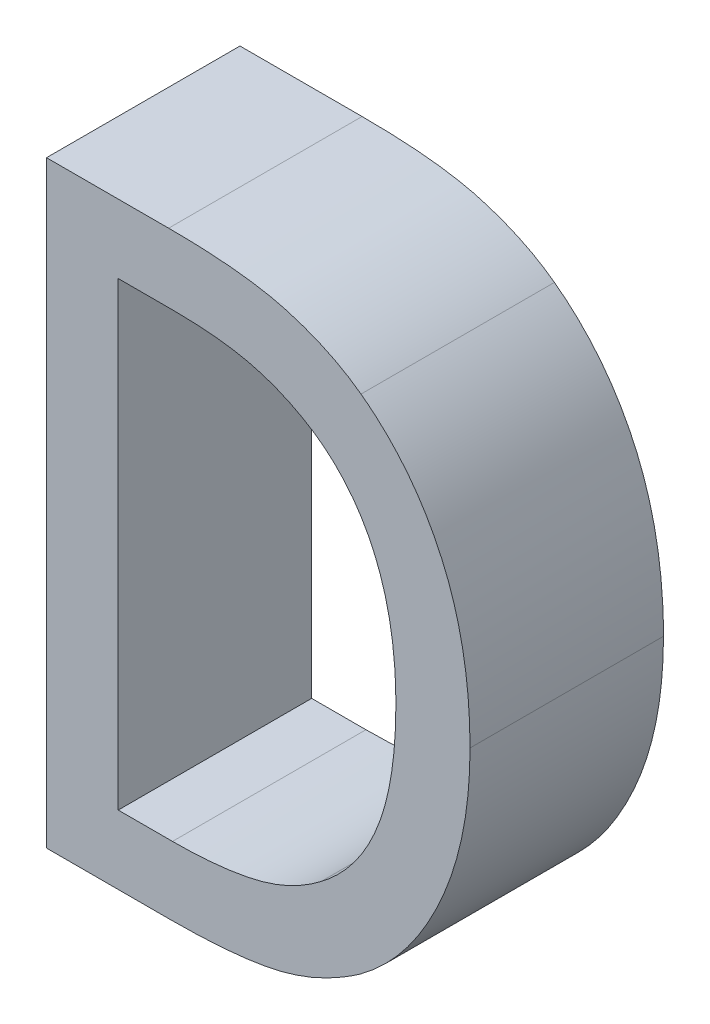
ISO-10303-21;
HEADER;
FILE_DESCRIPTION(('STEP AP214'),'2;1');
FILE_NAME('part.step','',(''),(''),'','','');
FILE_SCHEMA(('AUTOMOTIVE_DESIGN { 1 0 10303 214 1 1 1 1 }'));
ENDSEC;
DATA;
#1=APPLICATION_CONTEXT('core data for automotive mechanical design processes');
#2=APPLICATION_PROTOCOL_DEFINITION('international standard','automotive_design',2000,#1);
#3=PRODUCT_CONTEXT('',#1,'mechanical');
#4=PRODUCT('Part','Part','',(#3));
#5=PRODUCT_RELATED_PRODUCT_CATEGORY('part','',(#4));
#6=PRODUCT_DEFINITION_FORMATION('','',#4);
#7=PRODUCT_DEFINITION_CONTEXT('part definition',#1,'design');
#8=PRODUCT_DEFINITION('design','',#6,#7);
#9=PRODUCT_DEFINITION_SHAPE('','',#8);
#10=(LENGTH_UNIT() NAMED_UNIT(*) SI_UNIT(.MILLI.,.METRE.));
#11=(NAMED_UNIT(*) PLANE_ANGLE_UNIT() SI_UNIT($,.RADIAN.));
#12=(NAMED_UNIT(*) SI_UNIT($,.STERADIAN.) SOLID_ANGLE_UNIT());
#13=UNCERTAINTY_MEASURE_WITH_UNIT(LENGTH_MEASURE(1.E-05),#10,'distance_accuracy_value','');
#14=(GEOMETRIC_REPRESENTATION_CONTEXT(3) GLOBAL_UNCERTAINTY_ASSIGNED_CONTEXT((#13)) GLOBAL_UNIT_ASSIGNED_CONTEXT((#10,
#11,#12)) REPRESENTATION_CONTEXT('',''));
#15=CARTESIAN_POINT('',(0.,0.,0.));
#16=DIRECTION('',(0.,0.,1.));
#17=DIRECTION('',(1.,0.,0.));
#18=AXIS2_PLACEMENT_3D('',#15,#16,#17);
#19=CARTESIAN_POINT('',(-4.186562524692,0.245536814850665,0.));
#20=CARTESIAN_POINT('',(-4.186562524692,0.245536814850665,0.1));
#21=CARTESIAN_POINT('',(-4.167274883108,0.260065168251858,0.));
#22=CARTESIAN_POINT('',(-4.167274883108,0.260065168251858,0.1));
#23=CARTESIAN_POINT('',(-4.147987241524,0.30815902778684,0.));
#24=CARTESIAN_POINT('',(-4.147987241524,0.30815902778684,0.1));
#25=CARTESIAN_POINT('',(-4.147987241524,0.344229422438077,0.));
#26=CARTESIAN_POINT('',(-4.147987241524,0.344229422438077,0.1));
#27=B_SPLINE_SURFACE_WITH_KNOTS('',2,1,((#19,#20),(#21,#22),(#23,#24),(#25,#26)),.UNSPECIFIED.,
.F.,.F.,.F.,(3,1,3),(2,2),(0.,1.,2.),(0.,0.01),.UNSPECIFIED.);
#28=CARTESIAN_POINT('',(-4.186562524692,0.245536814850665,0.));
#29=CARTESIAN_POINT('',(-4.167274883108,0.260065168251858,0.));
#30=CARTESIAN_POINT('',(-4.147987241524,0.30815902778684,0.));
#31=CARTESIAN_POINT('',(-4.147987241524,0.344229422438077,0.));
#32=B_SPLINE_CURVE_WITH_KNOTS('',2,(#28,#29,#30,#31),.UNSPECIFIED.,.F.,.F.,(3,1,3),(0.,1.,2.),.UNSPECIFIED.);
#33=CARTESIAN_POINT('',(-4.186562524692,0.245536814850665,0.));
#34=VERTEX_POINT('',#33);
#35=CARTESIAN_POINT('',(-4.147987241524,0.344229422438077,0.));
#36=VERTEX_POINT('',#35);
#37=EDGE_CURVE('E11',#34,#36,#32,.T.);
#38=DIRECTION('',(0.,0.,1.));
#39=VECTOR('',#38,1.);
#40=CARTESIAN_POINT('',(-4.186562524692,0.245536814850665,0.));
#41=LINE('',#40,#39);
#42=CARTESIAN_POINT('',(-4.186562524692,0.245536814850665,0.1));
#43=VERTEX_POINT('',#42);
#44=EDGE_CURVE('E28',#34,#43,#41,.T.);
#45=CARTESIAN_POINT('',(-4.147987241524,0.344229422438077,0.1));
#46=CARTESIAN_POINT('',(-4.147987241524,0.30815902778684,0.1));
#47=CARTESIAN_POINT('',(-4.167274883108,0.260065168251858,0.1));
#48=CARTESIAN_POINT('',(-4.186562524692,0.245536814850665,0.1));
#49=B_SPLINE_CURVE_WITH_KNOTS('',2,(#45,#46,#47,#48),.UNSPECIFIED.,.F.,.F.,(3,1,3),(-2.,-1.,0.),.UNSPECIFIED.);
#50=CARTESIAN_POINT('',(-4.147987241524,0.344229422438077,0.1));
#51=VERTEX_POINT('',#50);
#52=EDGE_CURVE('E305',#51,#43,#49,.T.);
#53=DIRECTION('',(0.,0.,1.));
#54=VECTOR('',#53,1.);
#55=CARTESIAN_POINT('',(-4.147987241524,0.344229422438077,0.));
#56=LINE('',#55,#54);
#57=EDGE_CURVE('E41',#36,#51,#56,.T.);
#58=ORIENTED_EDGE('',*,*,#37,.F.);
#59=ORIENTED_EDGE('',*,*,#44,.T.);
#60=ORIENTED_EDGE('',*,*,#52,.F.);
#61=ORIENTED_EDGE('',*,*,#57,.F.);
#62=EDGE_LOOP('',(#58,#59,#60,#61));
#63=FACE_BOUND('',#62,.T.);
#64=ADVANCED_FACE('F17',(#63),#27,.F.);
#65=CARTESIAN_POINT('',(-4.263462602178,0.2249967290076,0.));
#66=CARTESIAN_POINT('',(-4.263462602178,0.2249967290076,0.1));
#67=CARTESIAN_POINT('',(-4.238664205855,0.2249967290076,0.));
#68=CARTESIAN_POINT('',(-4.238664205855,0.2249967290076,0.1));
#69=CARTESIAN_POINT('',(-4.201842344649,0.233763838818664,0.));
#70=CARTESIAN_POINT('',(-4.201842344649,0.233763838818664,0.1));
#71=CARTESIAN_POINT('',(-4.186562524692,0.245536814850665,0.));
#72=CARTESIAN_POINT('',(-4.186562524692,0.245536814850665,0.1));
#73=B_SPLINE_SURFACE_WITH_KNOTS('',2,1,((#65,#66),(#67,#68),(#69,#70),(#71,#72)),.UNSPECIFIED.,
.F.,.F.,.F.,(3,1,3),(2,2),(0.,1.,2.),(0.,0.01),.UNSPECIFIED.);
#74=CARTESIAN_POINT('',(-4.263462602178,0.2249967290076,0.));
#75=CARTESIAN_POINT('',(-4.238664205855,0.2249967290076,0.));
#76=CARTESIAN_POINT('',(-4.201842344649,0.233763838818664,0.));
#77=CARTESIAN_POINT('',(-4.186562524692,0.245536814850665,0.));
#78=B_SPLINE_CURVE_WITH_KNOTS('',2,(#74,#75,#76,#77),.UNSPECIFIED.,.F.,.F.,(3,1,3),(0.,1.,2.),.UNSPECIFIED.);
#79=CARTESIAN_POINT('',(-4.263462602178,0.2249967290076,0.));
#80=VERTEX_POINT('',#79);
#81=EDGE_CURVE('E296',#80,#34,#78,.T.);
#82=DIRECTION('',(0.,0.,1.));
#83=VECTOR('',#82,1.);
#84=CARTESIAN_POINT('',(-4.263462602178,0.2249967290076,0.));
#85=LINE('',#84,#83);
#86=CARTESIAN_POINT('',(-4.263462602178,0.2249967290076,0.1));
#87=VERTEX_POINT('',#86);
#88=EDGE_CURVE('E290',#80,#87,#85,.T.);
#89=CARTESIAN_POINT('',(-4.186562524692,0.245536814850665,0.1));
#90=CARTESIAN_POINT('',(-4.201842344649,0.233763838818664,0.1));
#91=CARTESIAN_POINT('',(-4.238664205855,0.2249967290076,0.1));
#92=CARTESIAN_POINT('',(-4.263462602178,0.2249967290076,0.1));
#93=B_SPLINE_CURVE_WITH_KNOTS('',2,(#89,#90,#91,#92),.UNSPECIFIED.,.F.,.F.,(3,1,3),(-2.,-1.,0.),.UNSPECIFIED.);
#94=EDGE_CURVE('E286',#43,#87,#93,.T.);
#95=ORIENTED_EDGE('',*,*,#81,.F.);
#96=ORIENTED_EDGE('',*,*,#88,.T.);
#97=ORIENTED_EDGE('',*,*,#94,.F.);
#98=ORIENTED_EDGE('',*,*,#44,.F.);
#99=EDGE_LOOP('',(#95,#96,#97,#98));
#100=FACE_BOUND('',#99,.T.);
#101=ADVANCED_FACE('F311',(#100),#73,.F.);
#102=CARTESIAN_POINT('',(-4.291517353573,0.2249967290076,0.));
#103=DIRECTION('',(0.,-1.,0.));
#104=DIRECTION('',(1.,0.,0.));
#105=AXIS2_PLACEMENT_3D('',#102,#103,#104);
#106=PLANE('',#105);
#107=DIRECTION('',(1.,0.,0.));
#108=VECTOR('',#107,1.);
#109=CARTESIAN_POINT('',(-4.269338020412,0.2249967290076,0.));
#110=LINE('',#109,#108);
#111=CARTESIAN_POINT('',(-4.291517353573,0.2249967290076,0.));
#112=VERTEX_POINT('',#111);
#113=EDGE_CURVE('E283',#112,#80,#110,.T.);
#114=ORIENTED_EDGE('',*,*,#113,.F.);
#115=DIRECTION('',(0.,0.,1.));
#116=VECTOR('',#115,1.);
#117=CARTESIAN_POINT('',(-4.291517353573,0.2249967290076,0.));
#118=LINE('',#117,#116);
#119=CARTESIAN_POINT('',(-4.291517353573,0.2249967290076,0.1));
#120=VERTEX_POINT('',#119);
#121=EDGE_CURVE('E281',#112,#120,#118,.T.);
#122=ORIENTED_EDGE('',*,*,#121,.T.);
#123=DIRECTION('',(-1.,0.,0.));
#124=VECTOR('',#123,1.);
#125=CARTESIAN_POINT('',(-4.269338020412,0.2249967290076,0.1));
#126=LINE('',#125,#124);
#127=EDGE_CURVE('E278',#87,#120,#126,.T.);
#128=ORIENTED_EDGE('',*,*,#127,.F.);
#129=ORIENTED_EDGE('',*,*,#88,.F.);
#130=EDGE_LOOP('',(#114,#122,#128,#129));
#131=FACE_BOUND('',#130,.T.);
#132=ADVANCED_FACE('F324',(#131),#106,.F.);
#133=CARTESIAN_POINT('',(-4.291517353573,0.462961138165064,0.));
#134=DIRECTION('',(-1.,0.,0.));
#135=DIRECTION('',(0.,-1.,0.));
#136=AXIS2_PLACEMENT_3D('',#133,#134,#135);
#137=PLANE('',#136);
#138=DIRECTION('',(0.,-1.,0.));
#139=VECTOR('',#138,1.);
#140=CARTESIAN_POINT('',(-4.291517353573,0.403493655322263,0.));
#141=LINE('',#140,#139);
#142=CARTESIAN_POINT('',(-4.291517353573,0.462961138165064,0.));
#143=VERTEX_POINT('',#142);
#144=EDGE_CURVE('E275',#143,#112,#141,.T.);
#145=ORIENTED_EDGE('',*,*,#144,.F.);
#146=DIRECTION('',(0.,0.,1.));
#147=VECTOR('',#146,1.);
#148=CARTESIAN_POINT('',(-4.291517353573,0.462961138165064,0.));
#149=LINE('',#148,#147);
#150=CARTESIAN_POINT('',(-4.291517353573,0.462961138165064,0.1));
#151=VERTEX_POINT('',#150);
#152=EDGE_CURVE('E273',#143,#151,#149,.T.);
#153=ORIENTED_EDGE('',*,*,#152,.T.);
#154=DIRECTION('',(0.,1.,0.));
#155=VECTOR('',#154,1.);
#156=CARTESIAN_POINT('',(-4.291517353573,0.403493655322263,0.1));
#157=LINE('',#156,#155);
#158=EDGE_CURVE('E270',#120,#151,#157,.T.);
#159=ORIENTED_EDGE('',*,*,#158,.F.);
#160=ORIENTED_EDGE('',*,*,#121,.F.);
#161=EDGE_LOOP('',(#145,#153,#159,#160));
#162=FACE_BOUND('',#161,.T.);
#163=ADVANCED_FACE('F326',(#162),#137,.F.);
#164=CARTESIAN_POINT('',(-4.263462602178,0.462961138165064,0.));
#165=DIRECTION('',(0.,1.,0.));
#166=DIRECTION('',(-1.,0.,0.));
#167=AXIS2_PLACEMENT_3D('',#164,#165,#166);
#168=PLANE('',#167);
#169=DIRECTION('',(-1.,0.,0.));
#170=VECTOR('',#169,1.);
#171=CARTESIAN_POINT('',(-4.255310644714,0.462961138165064,0.));
#172=LINE('',#171,#170);
#173=CARTESIAN_POINT('',(-4.263462602178,0.462961138165064,0.));
#174=VERTEX_POINT('',#173);
#175=EDGE_CURVE('E267',#174,#143,#172,.T.);
#176=ORIENTED_EDGE('',*,*,#175,.F.);
#177=DIRECTION('',(0.,0.,1.));
#178=VECTOR('',#177,1.);
#179=CARTESIAN_POINT('',(-4.263462602178,0.462961138165064,0.));
#180=LINE('',#179,#178);
#181=CARTESIAN_POINT('',(-4.263462602178,0.462961138165064,0.1));
#182=VERTEX_POINT('',#181);
#183=EDGE_CURVE('E265',#174,#182,#180,.T.);
#184=ORIENTED_EDGE('',*,*,#183,.T.);
#185=DIRECTION('',(1.,0.,0.));
#186=VECTOR('',#185,1.);
#187=CARTESIAN_POINT('',(-4.255310644714,0.462961138165064,0.1));
#188=LINE('',#187,#186);
#189=EDGE_CURVE('E259',#151,#182,#188,.T.);
#190=ORIENTED_EDGE('',*,*,#189,.F.);
#191=ORIENTED_EDGE('',*,*,#152,.F.);
#192=EDGE_LOOP('',(#176,#184,#190,#191));
#193=FACE_BOUND('',#192,.T.);
#194=ADVANCED_FACE('F330',(#193),#168,.F.);
#195=CARTESIAN_POINT('',(-4.190069368617,0.444424963135956,0.));
#196=CARTESIAN_POINT('',(-4.190069368617,0.444424963135956,0.1));
#197=CARTESIAN_POINT('',(-4.20484821087,0.454194028354,0.));
#198=CARTESIAN_POINT('',(-4.20484821087,0.454194028354,0.1));
#199=CARTESIAN_POINT('',(-4.238413717004,0.462961138165064,0.));
#200=CARTESIAN_POINT('',(-4.238413717004,0.462961138165064,0.1));
#201=CARTESIAN_POINT('',(-4.263462602178,0.462961138165064,0.));
#202=CARTESIAN_POINT('',(-4.263462602178,0.462961138165064,0.1));
#203=B_SPLINE_SURFACE_WITH_KNOTS('',2,1,((#195,#196),(#197,#198),(#199,#200),(#201,#202)),
.UNSPECIFIED.,.F.,.F.,.F.,(3,1,3),(2,2),(0.,1.,2.),(0.,0.01),.UNSPECIFIED.);
#204=CARTESIAN_POINT('',(-4.190069368617,0.444424963135956,0.));
#205=CARTESIAN_POINT('',(-4.20484821087,0.454194028354,0.));
#206=CARTESIAN_POINT('',(-4.238413717004,0.462961138165064,0.));
#207=CARTESIAN_POINT('',(-4.263462602178,0.462961138165064,0.));
#208=B_SPLINE_CURVE_WITH_KNOTS('',2,(#204,#205,#206,#207),.UNSPECIFIED.,.F.,.F.,(3,1,3),(0.,1.,
2.),.UNSPECIFIED.);
#209=CARTESIAN_POINT('',(-4.190069368617,0.444424963135956,0.));
#210=VERTEX_POINT('',#209);
#211=EDGE_CURVE('E254',#210,#174,#208,.T.);
#212=DIRECTION('',(0.,0.,1.));
#213=VECTOR('',#212,1.);
#214=CARTESIAN_POINT('',(-4.190069368617,0.444424963135956,0.));
#215=LINE('',#214,#213);
#216=CARTESIAN_POINT('',(-4.190069368617,0.444424963135956,0.1));
#217=VERTEX_POINT('',#216);
#218=EDGE_CURVE('E248',#210,#217,#215,.T.);
#219=CARTESIAN_POINT('',(-4.263462602178,0.462961138165064,0.1));
#220=CARTESIAN_POINT('',(-4.238413717004,0.462961138165064,0.1));
#221=CARTESIAN_POINT('',(-4.20484821087,0.454194028354,0.1));
#222=CARTESIAN_POINT('',(-4.190069368617,0.444424963135956,0.1));
#223=B_SPLINE_CURVE_WITH_KNOTS('',2,(#219,#220,#221,#222),.UNSPECIFIED.,.F.,.F.,(3,1,3),(-2.,
-1.,0.),.UNSPECIFIED.);
#224=EDGE_CURVE('E241',#182,#217,#223,.T.);
#225=ORIENTED_EDGE('',*,*,#211,.F.);
#226=ORIENTED_EDGE('',*,*,#218,.T.);
#227=ORIENTED_EDGE('',*,*,#224,.F.);
#228=ORIENTED_EDGE('',*,*,#183,.F.);
#229=EDGE_LOOP('',(#225,#226,#227,#228));
#230=FACE_BOUND('',#229,.T.);
#231=ADVANCED_FACE('F333',(#230),#203,.F.);
#232=CARTESIAN_POINT('',(-4.147987241524,0.344229422438077,0.));
#233=CARTESIAN_POINT('',(-4.147987241524,0.344229422438077,0.1));
#234=CARTESIAN_POINT('',(-4.147987241524,0.379798839385824,0.));
#235=CARTESIAN_POINT('',(-4.147987241524,0.379798839385824,0.1));
#236=CARTESIAN_POINT('',(-4.169278793922,0.430147098586509,0.));
#237=CARTESIAN_POINT('',(-4.169278793922,0.430147098586509,0.1));
#238=CARTESIAN_POINT('',(-4.190069368617,0.444424963135956,0.));
#239=CARTESIAN_POINT('',(-4.190069368617,0.444424963135956,0.1));
#240=B_SPLINE_SURFACE_WITH_KNOTS('',2,1,((#232,#233),(#234,#235),(#236,#237),(#238,#239)),
.UNSPECIFIED.,.F.,.F.,.F.,(3,1,3),(2,2),(0.,1.,2.),(0.,0.01),.UNSPECIFIED.);
#241=CARTESIAN_POINT('',(-4.147987241524,0.344229422438077,0.));
#242=CARTESIAN_POINT('',(-4.147987241524,0.379798839385824,0.));
#243=CARTESIAN_POINT('',(-4.169278793922,0.430147098586509,0.));
#244=CARTESIAN_POINT('',(-4.190069368617,0.444424963135956,0.));
#245=B_SPLINE_CURVE_WITH_KNOTS('',2,(#241,#242,#243,#244),.UNSPECIFIED.,.F.,.F.,(3,1,3),(0.,1.,
2.),.UNSPECIFIED.);
#246=EDGE_CURVE('E233',#36,#210,#245,.T.);
#247=CARTESIAN_POINT('',(-4.190069368617,0.444424963135956,0.1));
#248=CARTESIAN_POINT('',(-4.169278793922,0.430147098586509,0.1));
#249=CARTESIAN_POINT('',(-4.147987241524,0.379798839385824,0.1));
#250=CARTESIAN_POINT('',(-4.147987241524,0.344229422438077,0.1));
#251=B_SPLINE_CURVE_WITH_KNOTS('',2,(#247,#248,#249,#250),.UNSPECIFIED.,.F.,.F.,(3,1,3),(-2.,
-1.,0.),.UNSPECIFIED.);
#252=EDGE_CURVE('E225',#217,#51,#251,.T.);
#253=ORIENTED_EDGE('',*,*,#246,.F.);
#254=ORIENTED_EDGE('',*,*,#57,.T.);
#255=ORIENTED_EDGE('',*,*,#252,.F.);
#256=ORIENTED_EDGE('',*,*,#218,.F.);
#257=EDGE_LOOP('',(#253,#254,#255,#256));
#258=FACE_BOUND('',#257,.T.);
#259=ADVANCED_FACE('F318',(#258),#240,.F.);
#260=CARTESIAN_POINT('',(-4.264715046437,0.189427312059852,0.));
#261=CARTESIAN_POINT('',(-4.264715046437,0.189427312059852,0.1));
#262=CARTESIAN_POINT('',(-4.230899051451,0.189427312059852,0.));
#263=CARTESIAN_POINT('',(-4.230899051451,0.189427312059852,0.1));
#264=CARTESIAN_POINT('',(-4.187313991248,0.19944686612964,0.));
#265=CARTESIAN_POINT('',(-4.187313991248,0.19944686612964,0.1));
#266=CARTESIAN_POINT('',(-4.166272927701,0.214225708382577,0.));
#267=CARTESIAN_POINT('',(-4.166272927701,0.214225708382577,0.1));
#268=B_SPLINE_SURFACE_WITH_KNOTS('',2,1,((#260,#261),(#262,#263),(#264,#265),(#266,#267)),
.UNSPECIFIED.,.F.,.F.,.F.,(3,1,3),(2,2),(-2.,-1.,0.),(0.,0.01),.UNSPECIFIED.);
#269=CARTESIAN_POINT('',(-4.166272927701,0.214225708382577,0.));
#270=CARTESIAN_POINT('',(-4.187313991248,0.19944686612964,0.));
#271=CARTESIAN_POINT('',(-4.230899051451,0.189427312059852,0.));
#272=CARTESIAN_POINT('',(-4.264715046437,0.189427312059852,0.));
#273=B_SPLINE_CURVE_WITH_KNOTS('',2,(#269,#270,#271,#272),.UNSPECIFIED.,.F.,.F.,(3,1,3),(0.,1.,
2.),.UNSPECIFIED.);
#274=CARTESIAN_POINT('',(-4.166272927701,0.214225708382577,0.));
#275=VERTEX_POINT('',#274);
#276=CARTESIAN_POINT('',(-4.264715046437,0.189427312059852,0.));
#277=VERTEX_POINT('',#276);
#278=EDGE_CURVE('E221',#275,#277,#273,.T.);
#279=DIRECTION('',(0.,0.,1.));
#280=VECTOR('',#279,1.);
#281=CARTESIAN_POINT('',(-4.166272927701,0.214225708382577,0.));
#282=LINE('',#281,#280);
#283=CARTESIAN_POINT('',(-4.166272927701,0.214225708382577,0.1));
#284=VERTEX_POINT('',#283);
#285=EDGE_CURVE('E216',#275,#284,#282,.T.);
#286=CARTESIAN_POINT('',(-4.264715046437,0.189427312059852,0.1));
#287=CARTESIAN_POINT('',(-4.230899051451,0.189427312059852,0.1));
#288=CARTESIAN_POINT('',(-4.187313991248,0.19944686612964,0.1));
#289=CARTESIAN_POINT('',(-4.166272927701,0.214225708382577,0.1));
#290=B_SPLINE_CURVE_WITH_KNOTS('',2,(#286,#287,#288,#289),.UNSPECIFIED.,.F.,.F.,(3,1,3),(-2.,
-1.,0.),.UNSPECIFIED.);
#291=CARTESIAN_POINT('',(-4.264715046437,0.189427312059852,0.1));
#292=VERTEX_POINT('',#291);
#293=EDGE_CURVE('E147',#292,#284,#290,.T.);
#294=DIRECTION('',(0.,0.,1.));
#295=VECTOR('',#294,1.);
#296=CARTESIAN_POINT('',(-4.264715046437,0.189427312059852,0.));
#297=LINE('',#296,#295);
#298=EDGE_CURVE('E210',#277,#292,#297,.T.);
#299=ORIENTED_EDGE('',*,*,#278,.F.);
#300=ORIENTED_EDGE('',*,*,#285,.T.);
#301=ORIENTED_EDGE('',*,*,#293,.F.);
#302=ORIENTED_EDGE('',*,*,#298,.F.);
#303=EDGE_LOOP('',(#299,#300,#301,#302));
#304=FACE_BOUND('',#303,.T.);
#305=ADVANCED_FACE('F341',(#304),#268,.T.);
#306=CARTESIAN_POINT('',(-4.328589703632,0.189427312059852,0.));
#307=DIRECTION('',(0.,-1.,0.));
#308=DIRECTION('',(1.,0.,0.));
#309=AXIS2_PLACEMENT_3D('',#306,#307,#308);
#310=PLANE('',#309);
#311=DIRECTION('',(-1.,0.,0.));
#312=VECTOR('',#311,1.);
#313=CARTESIAN_POINT('',(-4.264715046437,0.189427312059852,0.));
#314=LINE('',#313,#312);
#315=CARTESIAN_POINT('',(-4.328589703632,0.189427312059852,0.));
#316=VERTEX_POINT('',#315);
#317=EDGE_CURVE('E208',#277,#316,#314,.T.);
#318=ORIENTED_EDGE('',*,*,#317,.F.);
#319=ORIENTED_EDGE('',*,*,#298,.T.);
#320=DIRECTION('',(1.,0.,0.));
#321=VECTOR('',#320,1.);
#322=CARTESIAN_POINT('',(-4.264715046437,0.189427312059852,0.1));
#323=LINE('',#322,#321);
#324=CARTESIAN_POINT('',(-4.328589703632,0.189427312059852,0.1));
#325=VERTEX_POINT('',#324);
#326=EDGE_CURVE('E206',#325,#292,#323,.T.);
#327=ORIENTED_EDGE('',*,*,#326,.F.);
#328=DIRECTION('',(0.,0.,1.));
#329=VECTOR('',#328,1.);
#330=CARTESIAN_POINT('',(-4.328589703632,0.189427312059852,0.));
#331=LINE('',#330,#329);
#332=EDGE_CURVE('E203',#316,#325,#331,.T.);
#333=ORIENTED_EDGE('',*,*,#332,.F.);
#334=EDGE_LOOP('',(#318,#319,#327,#333));
#335=FACE_BOUND('',#334,.T.);
#336=ADVANCED_FACE('F398',(#335),#310,.T.);
#337=CARTESIAN_POINT('',(-4.328589703632,0.498530555112812,0.));
#338=DIRECTION('',(-1.,0.,0.));
#339=DIRECTION('',(0.,-1.,0.));
#340=AXIS2_PLACEMENT_3D('',#337,#338,#339);
#341=PLANE('',#340);
#342=DIRECTION('',(0.,1.,0.));
#343=VECTOR('',#342,1.);
#344=CARTESIAN_POINT('',(-4.328589703632,0.189427312059852,0.));
#345=LINE('',#344,#343);
#346=CARTESIAN_POINT('',(-4.328589703632,0.498530555112812,0.));
#347=VERTEX_POINT('',#346);
#348=EDGE_CURVE('E201',#316,#347,#345,.T.);
#349=ORIENTED_EDGE('',*,*,#348,.F.);
#350=ORIENTED_EDGE('',*,*,#332,.T.);
#351=DIRECTION('',(0.,-1.,0.));
#352=VECTOR('',#351,1.);
#353=CARTESIAN_POINT('',(-4.328589703632,0.189427312059852,0.1));
#354=LINE('',#353,#352);
#355=CARTESIAN_POINT('',(-4.328589703632,0.498530555112812,0.1));
#356=VERTEX_POINT('',#355);
#357=EDGE_CURVE('E198',#356,#325,#354,.T.);
#358=ORIENTED_EDGE('',*,*,#357,.F.);
#359=DIRECTION('',(0.,0.,1.));
#360=VECTOR('',#359,1.);
#361=CARTESIAN_POINT('',(-4.328589703632,0.498530555112812,0.));
#362=LINE('',#361,#360);
#363=EDGE_CURVE('E195',#347,#356,#362,.T.);
#364=ORIENTED_EDGE('',*,*,#363,.F.);
#365=EDGE_LOOP('',(#349,#350,#358,#364));
#366=FACE_BOUND('',#365,.T.);
#367=ADVANCED_FACE('F408',(#366),#341,.T.);
#368=CARTESIAN_POINT('',(-4.265466512992,0.498530555112812,0.));
#369=DIRECTION('',(0.,1.,0.));
#370=DIRECTION('',(-1.,0.,0.));
#371=AXIS2_PLACEMENT_3D('',#368,#369,#370);
#372=PLANE('',#371);
#373=DIRECTION('',(1.,0.,0.));
#374=VECTOR('',#373,1.);
#375=CARTESIAN_POINT('',(-4.328589703632,0.498530555112812,0.));
#376=LINE('',#375,#374);
#377=CARTESIAN_POINT('',(-4.265466512992,0.498530555112812,0.));
#378=VERTEX_POINT('',#377);
#379=EDGE_CURVE('E193',#347,#378,#376,.T.);
#380=ORIENTED_EDGE('',*,*,#379,.F.);
#381=ORIENTED_EDGE('',*,*,#363,.T.);
#382=DIRECTION('',(-1.,0.,0.));
#383=VECTOR('',#382,1.);
#384=CARTESIAN_POINT('',(-4.328589703632,0.498530555112812,0.1));
#385=LINE('',#384,#383);
#386=CARTESIAN_POINT('',(-4.265466512992,0.498530555112812,0.1));
#387=VERTEX_POINT('',#386);
#388=EDGE_CURVE('E190',#387,#356,#385,.T.);
#389=ORIENTED_EDGE('',*,*,#388,.F.);
#390=DIRECTION('',(0.,0.,1.));
#391=VECTOR('',#390,1.);
#392=CARTESIAN_POINT('',(-4.265466512992,0.498530555112812,0.));
#393=LINE('',#392,#391);
#394=EDGE_CURVE('E184',#378,#387,#393,.T.);
#395=ORIENTED_EDGE('',*,*,#394,.F.);
#396=EDGE_LOOP('',(#380,#381,#389,#395));
#397=FACE_BOUND('',#396,.T.);
#398=ADVANCED_FACE('F418',(#397),#372,.T.);
#399=CARTESIAN_POINT('',(-4.166022438849,0.473982647641831,0.));
#400=CARTESIAN_POINT('',(-4.166022438849,0.473982647641831,0.1));
#401=CARTESIAN_POINT('',(-4.181552747657,0.485505134822087,0.));
#402=CARTESIAN_POINT('',(-4.181552747657,0.485505134822087,0.1));
#403=CARTESIAN_POINT('',(-4.226139763268,0.498530555112812,0.));
#404=CARTESIAN_POINT('',(-4.226139763268,0.498530555112812,0.1));
#405=CARTESIAN_POINT('',(-4.265466512992,0.498530555112812,0.));
#406=CARTESIAN_POINT('',(-4.265466512992,0.498530555112812,0.1));
#407=B_SPLINE_SURFACE_WITH_KNOTS('',2,1,((#399,#400),(#401,#402),(#403,#404),(#405,#406)),
.UNSPECIFIED.,.F.,.F.,.F.,(3,1,3),(2,2),(-2.,-1.,0.),(0.,0.01),.UNSPECIFIED.);
#408=CARTESIAN_POINT('',(-4.265466512992,0.498530555112812,0.));
#409=CARTESIAN_POINT('',(-4.226139763268,0.498530555112812,0.));
#410=CARTESIAN_POINT('',(-4.181552747657,0.485505134822087,0.));
#411=CARTESIAN_POINT('',(-4.166022438849,0.473982647641831,0.));
#412=B_SPLINE_CURVE_WITH_KNOTS('',2,(#408,#409,#410,#411),.UNSPECIFIED.,.F.,.F.,(3,1,3),(0.,1.,
2.),.UNSPECIFIED.);
#413=CARTESIAN_POINT('',(-4.166022438849,0.473982647641831,0.));
#414=VERTEX_POINT('',#413);
#415=EDGE_CURVE('E177',#378,#414,#412,.T.);
#416=CARTESIAN_POINT('',(-4.166022438849,0.473982647641831,0.1));
#417=CARTESIAN_POINT('',(-4.181552747657,0.485505134822087,0.1));
#418=CARTESIAN_POINT('',(-4.226139763268,0.498530555112812,0.1));
#419=CARTESIAN_POINT('',(-4.265466512992,0.498530555112812,0.1));
#420=B_SPLINE_CURVE_WITH_KNOTS('',2,(#416,#417,#418,#419),.UNSPECIFIED.,.F.,.F.,(3,1,3),(-2.,
-1.,0.),.UNSPECIFIED.);
#421=CARTESIAN_POINT('',(-4.166022438849,0.473982647641831,0.1));
#422=VERTEX_POINT('',#421);
#423=EDGE_CURVE('E173',#422,#387,#420,.T.);
#424=DIRECTION('',(0.,0.,1.));
#425=VECTOR('',#424,1.);
#426=CARTESIAN_POINT('',(-4.166022438849,0.473982647641831,0.));
#427=LINE('',#426,#425);
#428=EDGE_CURVE('E129',#414,#422,#427,.T.);
#429=ORIENTED_EDGE('',*,*,#415,.F.);
#430=ORIENTED_EDGE('',*,*,#394,.T.);
#431=ORIENTED_EDGE('',*,*,#423,.F.);
#432=ORIENTED_EDGE('',*,*,#428,.F.);
#433=EDGE_LOOP('',(#429,#430,#431,#432));
#434=FACE_BOUND('',#433,.T.);
#435=ADVANCED_FACE('F428',(#434),#407,.T.);
#436=CARTESIAN_POINT('',(-4.109662447207,0.343728444734587,0.));
#437=CARTESIAN_POINT('',(-4.109662447207,0.343728444734587,0.1));
#438=CARTESIAN_POINT('',(-4.109662447207,0.388816438048633,0.));
#439=CARTESIAN_POINT('',(-4.109662447207,0.388816438048633,0.1));
#440=CARTESIAN_POINT('',(-4.139220131713,0.454194028354,0.));
#441=CARTESIAN_POINT('',(-4.139220131713,0.454194028354,0.1));
#442=CARTESIAN_POINT('',(-4.166022438849,0.473982647641831,0.));
#443=CARTESIAN_POINT('',(-4.166022438849,0.473982647641831,0.1));
#444=B_SPLINE_SURFACE_WITH_KNOTS('',2,1,((#436,#437),(#438,#439),(#440,#441),(#442,#443)),
.UNSPECIFIED.,.F.,.F.,.F.,(3,1,3),(2,2),(-2.,-1.,0.),(0.,0.01),.UNSPECIFIED.);
#445=CARTESIAN_POINT('',(-4.166022438849,0.473982647641831,0.));
#446=CARTESIAN_POINT('',(-4.139220131713,0.454194028354,0.));
#447=CARTESIAN_POINT('',(-4.109662447207,0.388816438048633,0.));
#448=CARTESIAN_POINT('',(-4.109662447207,0.343728444734587,0.));
#449=B_SPLINE_CURVE_WITH_KNOTS('',2,(#445,#446,#447,#448),.UNSPECIFIED.,.F.,.F.,(3,1,3),(0.,1.,
2.),.UNSPECIFIED.);
#450=CARTESIAN_POINT('',(-4.109662447207,0.343728444734587,0.));
#451=VERTEX_POINT('',#450);
#452=EDGE_CURVE('E133',#414,#451,#449,.T.);
#453=CARTESIAN_POINT('',(-4.109662447207,0.343728444734587,0.1));
#454=CARTESIAN_POINT('',(-4.109662447207,0.388816438048633,0.1));
#455=CARTESIAN_POINT('',(-4.139220131713,0.454194028354,0.1));
#456=CARTESIAN_POINT('',(-4.166022438849,0.473982647641831,0.1));
#457=B_SPLINE_CURVE_WITH_KNOTS('',2,(#453,#454,#455,#456),.UNSPECIFIED.,.F.,.F.,(3,1,3),(-2.,
-1.,0.),.UNSPECIFIED.);
#458=CARTESIAN_POINT('',(-4.109662447207,0.343728444734587,0.1));
#459=VERTEX_POINT('',#458);
#460=EDGE_CURVE('E122',#459,#422,#457,.T.);
#461=DIRECTION('',(0.,0.,1.));
#462=VECTOR('',#461,1.);
#463=CARTESIAN_POINT('',(-4.109662447207,0.343728444734587,0.));
#464=LINE('',#463,#462);
#465=EDGE_CURVE('E126',#451,#459,#464,.T.);
#466=ORIENTED_EDGE('',*,*,#452,.F.);
#467=ORIENTED_EDGE('',*,*,#428,.T.);
#468=ORIENTED_EDGE('',*,*,#460,.F.);
#469=ORIENTED_EDGE('',*,*,#465,.F.);
#470=EDGE_LOOP('',(#466,#467,#468,#469));
#471=FACE_BOUND('',#470,.T.);
#472=ADVANCED_FACE('F125',(#471),#444,.T.);
#473=CARTESIAN_POINT('',(-4.166272927701,0.214225708382577,0.));
#474=CARTESIAN_POINT('',(-4.166272927701,0.214225708382577,0.1));
#475=CARTESIAN_POINT('',(-4.140472575971,0.233262861115175,0.));
#476=CARTESIAN_POINT('',(-4.140472575971,0.233262861115175,0.1));
#477=CARTESIAN_POINT('',(-4.109662447207,0.301395828789733,0.));
#478=CARTESIAN_POINT('',(-4.109662447207,0.301395828789733,0.1));
#479=CARTESIAN_POINT('',(-4.109662447207,0.343728444734587,0.));
#480=CARTESIAN_POINT('',(-4.109662447207,0.343728444734587,0.1));
#481=B_SPLINE_SURFACE_WITH_KNOTS('',2,1,((#473,#474),(#475,#476),(#477,#478),(#479,#480)),
.UNSPECIFIED.,.F.,.F.,.F.,(3,1,3),(2,2),(-2.,-1.,0.),(0.,0.01),.UNSPECIFIED.);
#482=CARTESIAN_POINT('',(-4.109662447207,0.343728444734587,0.));
#483=CARTESIAN_POINT('',(-4.109662447207,0.301395828789733,0.));
#484=CARTESIAN_POINT('',(-4.140472575971,0.233262861115175,0.));
#485=CARTESIAN_POINT('',(-4.166272927701,0.214225708382577,0.));
#486=B_SPLINE_CURVE_WITH_KNOTS('',2,(#482,#483,#484,#485),.UNSPECIFIED.,.F.,.F.,(3,1,3),(0.,1.,
2.),.UNSPECIFIED.);
#487=EDGE_CURVE('E141',#451,#275,#486,.T.);
#488=CARTESIAN_POINT('',(-4.166272927701,0.214225708382577,0.1));
#489=CARTESIAN_POINT('',(-4.140472575971,0.233262861115175,0.1));
#490=CARTESIAN_POINT('',(-4.109662447207,0.301395828789733,0.1));
#491=CARTESIAN_POINT('',(-4.109662447207,0.343728444734587,0.1));
#492=B_SPLINE_CURVE_WITH_KNOTS('',2,(#488,#489,#490,#491),.UNSPECIFIED.,.F.,.F.,(3,1,3),(-2.,
-1.,0.),.UNSPECIFIED.);
#493=EDGE_CURVE('E139',#284,#459,#492,.T.);
#494=ORIENTED_EDGE('',*,*,#487,.F.);
#495=ORIENTED_EDGE('',*,*,#465,.T.);
#496=ORIENTED_EDGE('',*,*,#493,.F.);
#497=ORIENTED_EDGE('',*,*,#285,.F.);
#498=EDGE_LOOP('',(#494,#495,#496,#497));
#499=FACE_BOUND('',#498,.T.);
#500=ADVANCED_FACE('F137',(#499),#481,.T.);
#501=CARTESIAN_POINT('',(-4.24715868725,0.344026172479461,0.));
#502=DIRECTION('',(0.,0.,1.));
#503=DIRECTION('',(1.,0.,0.));
#504=AXIS2_PLACEMENT_3D('',#501,#502,#503);
#505=PLANE('',#504);
#506=ORIENTED_EDGE('',*,*,#487,.T.);
#507=ORIENTED_EDGE('',*,*,#278,.T.);
#508=ORIENTED_EDGE('',*,*,#317,.T.);
#509=ORIENTED_EDGE('',*,*,#348,.T.);
#510=ORIENTED_EDGE('',*,*,#379,.T.);
#511=ORIENTED_EDGE('',*,*,#415,.T.);
#512=ORIENTED_EDGE('',*,*,#452,.T.);
#513=EDGE_LOOP('',(#506,#507,#508,#509,#510,#511,#512));
#514=FACE_BOUND('',#513,.T.);
#515=ORIENTED_EDGE('',*,*,#37,.T.);
#516=ORIENTED_EDGE('',*,*,#246,.T.);
#517=ORIENTED_EDGE('',*,*,#211,.T.);
#518=ORIENTED_EDGE('',*,*,#175,.T.);
#519=ORIENTED_EDGE('',*,*,#144,.T.);
#520=ORIENTED_EDGE('',*,*,#113,.T.);
#521=ORIENTED_EDGE('',*,*,#81,.T.);
#522=EDGE_LOOP('',(#515,#516,#517,#518,#519,#520,#521));
#523=FACE_BOUND('',#522,.T.);
#524=ADVANCED_FACE('F321',(#514,#523),#505,.F.);
#525=CARTESIAN_POINT('',(-4.24715868725,0.344026172479461,0.1));
#526=DIRECTION('',(0.,0.,1.));
#527=DIRECTION('',(1.,0.,0.));
#528=AXIS2_PLACEMENT_3D('',#525,#526,#527);
#529=PLANE('',#528);
#530=ORIENTED_EDGE('',*,*,#493,.T.);
#531=ORIENTED_EDGE('',*,*,#460,.T.);
#532=ORIENTED_EDGE('',*,*,#423,.T.);
#533=ORIENTED_EDGE('',*,*,#388,.T.);
#534=ORIENTED_EDGE('',*,*,#357,.T.);
#535=ORIENTED_EDGE('',*,*,#326,.T.);
#536=ORIENTED_EDGE('',*,*,#293,.T.);
#537=EDGE_LOOP('',(#530,#531,#532,#533,#534,#535,#536));
#538=FACE_BOUND('',#537,.T.);
#539=ORIENTED_EDGE('',*,*,#52,.T.);
#540=ORIENTED_EDGE('',*,*,#94,.T.);
#541=ORIENTED_EDGE('',*,*,#127,.T.);
#542=ORIENTED_EDGE('',*,*,#158,.T.);
#543=ORIENTED_EDGE('',*,*,#189,.T.);
#544=ORIENTED_EDGE('',*,*,#224,.T.);
#545=ORIENTED_EDGE('',*,*,#252,.T.);
#546=EDGE_LOOP('',(#539,#540,#541,#542,#543,#544,#545));
#547=FACE_BOUND('',#546,.T.);
#548=ADVANCED_FACE('F144',(#538,#547),#529,.T.);
#549=CLOSED_SHELL('',(#64,#101,#132,#163,#194,#231,#259,#305,#336,#367,#398,#435,#472,#500,#524,#548));
#550=MANIFOLD_SOLID_BREP('B1',#549);
#551=ADVANCED_BREP_SHAPE_REPRESENTATION('',(#18,#550),#14);
#552=SHAPE_DEFINITION_REPRESENTATION(#9,#551);
ENDSEC;
END-ISO-10303-21;
